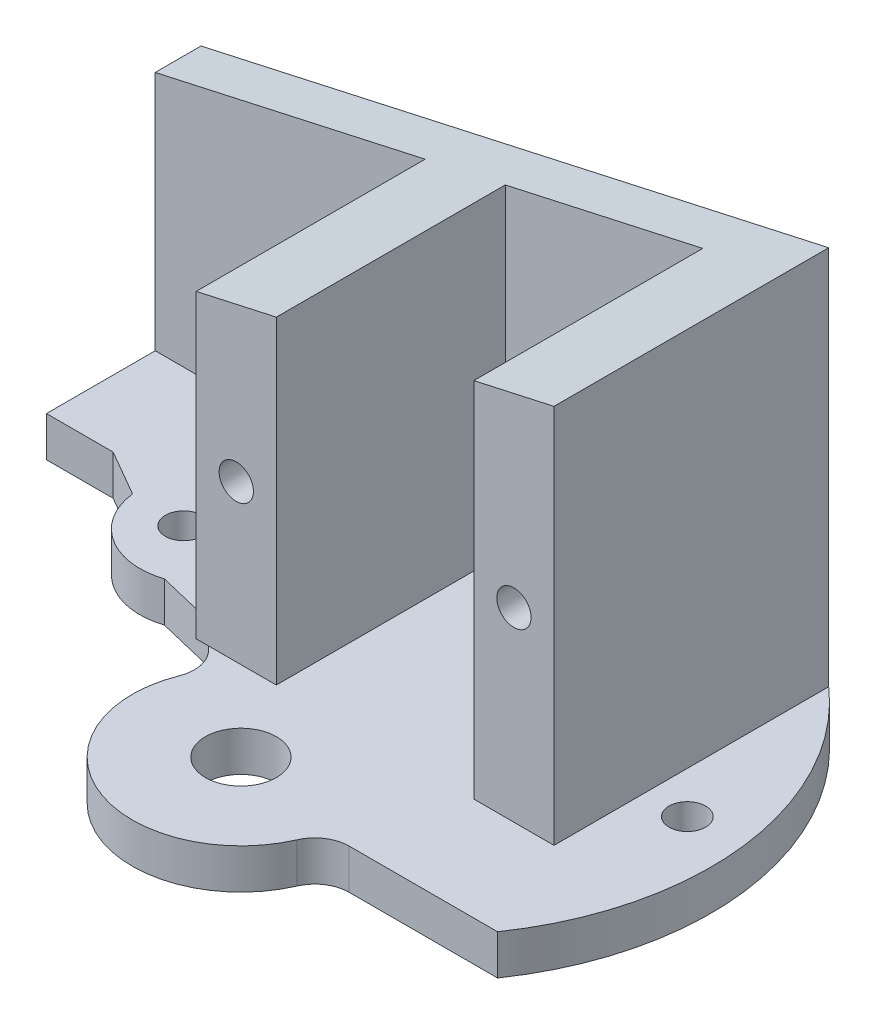
ISO-10303-21;
HEADER;
FILE_DESCRIPTION(('STEP AP214'),'2;1');
FILE_NAME('part.step','',(''),(''),'','','');
FILE_SCHEMA(('AUTOMOTIVE_DESIGN { 1 0 10303 214 1 1 1 1 }'));
ENDSEC;
DATA;
#1=APPLICATION_CONTEXT('core data for automotive mechanical design processes');
#2=APPLICATION_PROTOCOL_DEFINITION('international standard','automotive_design',2000,#1);
#3=PRODUCT_CONTEXT('',#1,'mechanical');
#4=PRODUCT('Part','Part','',(#3));
#5=PRODUCT_RELATED_PRODUCT_CATEGORY('part','',(#4));
#6=PRODUCT_DEFINITION_FORMATION('','',#4);
#7=PRODUCT_DEFINITION_CONTEXT('part definition',#1,'design');
#8=PRODUCT_DEFINITION('design','',#6,#7);
#9=PRODUCT_DEFINITION_SHAPE('','',#8);
#10=(LENGTH_UNIT() NAMED_UNIT(*) SI_UNIT(.MILLI.,.METRE.));
#11=(NAMED_UNIT(*) PLANE_ANGLE_UNIT() SI_UNIT($,.RADIAN.));
#12=(NAMED_UNIT(*) SI_UNIT($,.STERADIAN.) SOLID_ANGLE_UNIT());
#13=UNCERTAINTY_MEASURE_WITH_UNIT(LENGTH_MEASURE(1.E-05),#10,'distance_accuracy_value','');
#14=(GEOMETRIC_REPRESENTATION_CONTEXT(3) GLOBAL_UNCERTAINTY_ASSIGNED_CONTEXT((#13)) GLOBAL_UNIT_ASSIGNED_CONTEXT((#10,
#11,#12)) REPRESENTATION_CONTEXT('',''));
#15=CARTESIAN_POINT('',(0.,0.,0.));
#16=DIRECTION('',(0.,0.,1.));
#17=DIRECTION('',(1.,0.,0.));
#18=AXIS2_PLACEMENT_3D('',#15,#16,#17);
#19=CARTESIAN_POINT('',(-18.6805102122051,17.,1.64791691254111));
#20=DIRECTION('',(0.,1.,0.));
#21=DIRECTION('',(0.,0.,1.));
#22=AXIS2_PLACEMENT_3D('',#19,#20,#21);
#23=PLANE('',#22);
#24=CARTESIAN_POINT('',(0.,17.,17.5));
#25=DIRECTION('',(0.,1.,0.));
#26=DIRECTION('',(0.,0.,1.));
#27=AXIS2_PLACEMENT_3D('',#24,#25,#26);
#28=CIRCLE('',#27,3.1);
#29=CARTESIAN_POINT('',(0.,17.,20.6));
#30=VERTEX_POINT('',#29);
#31=EDGE_CURVE('E366',#30,#30,#28,.T.);
#32=ORIENTED_EDGE('',*,*,#31,.F.);
#33=EDGE_LOOP('',(#32));
#34=FACE_BOUND('',#33,.T.);
#35=CARTESIAN_POINT('',(24.,17.,2.50000000000001));
#36=DIRECTION('',(0.,1.,0.));
#37=DIRECTION('',(0.,0.,1.));
#38=AXIS2_PLACEMENT_3D('',#35,#36,#37);
#39=CIRCLE('',#38,1.6);
#40=CARTESIAN_POINT('',(24.,17.,4.10000000000001));
#41=VERTEX_POINT('',#40);
#42=EDGE_CURVE('E358',#41,#41,#39,.T.);
#43=ORIENTED_EDGE('',*,*,#42,.F.);
#44=EDGE_LOOP('',(#43));
#45=FACE_BOUND('',#44,.T.);
#46=DIRECTION('',(0.,0.,-1.));
#47=VECTOR('',#46,1.);
#48=CARTESIAN_POINT('',(20.3496,17.,-9.49999999999999));
#49=LINE('',#48,#47);
#50=CARTESIAN_POINT('',(20.3496,17.,10.5));
#51=VERTEX_POINT('',#50);
#52=CARTESIAN_POINT('',(20.3496,17.,-13.5));
#53=VERTEX_POINT('',#52);
#54=EDGE_CURVE('E197',#51,#53,#49,.T.);
#55=ORIENTED_EDGE('',*,*,#54,.F.);
#56=DIRECTION('',(1.,0.,0.));
#57=VECTOR('',#56,1.);
#58=CARTESIAN_POINT('',(13.3496,17.,10.5));
#59=LINE('',#58,#57);
#60=CARTESIAN_POINT('',(13.3496,17.,10.5));
#61=VERTEX_POINT('',#60);
#62=EDGE_CURVE('E211',#61,#51,#59,.T.);
#63=ORIENTED_EDGE('',*,*,#62,.F.);
#64=DIRECTION('',(0.,0.,-1.));
#65=VECTOR('',#64,1.);
#66=CARTESIAN_POINT('',(13.3496,17.,10.5));
#67=LINE('',#66,#65);
#68=CARTESIAN_POINT('',(13.3496,17.,-9.49999999999999));
#69=VERTEX_POINT('',#68);
#70=EDGE_CURVE('E220',#61,#69,#67,.T.);
#71=ORIENTED_EDGE('',*,*,#70,.T.);
#72=DIRECTION('',(-1.,0.,0.));
#73=VECTOR('',#72,1.);
#74=CARTESIAN_POINT('',(20.3496,17.,-9.49999999999999));
#75=LINE('',#74,#73);
#76=CARTESIAN_POINT('',(-3.90563132626724,17.,-9.49999999999999));
#77=VERTEX_POINT('',#76);
#78=EDGE_CURVE('E40',#69,#77,#75,.T.);
#79=ORIENTED_EDGE('',*,*,#78,.T.);
#80=DIRECTION('',(0.,0.,-1.));
#81=VECTOR('',#80,1.);
#82=CARTESIAN_POINT('',(-3.90563132626724,17.,10.5));
#83=LINE('',#82,#81);
#84=CARTESIAN_POINT('',(-3.90563132626724,17.,10.5));
#85=VERTEX_POINT('',#84);
#86=EDGE_CURVE('E243',#85,#77,#83,.T.);
#87=ORIENTED_EDGE('',*,*,#86,.F.);
#88=DIRECTION('',(1.,0.,0.));
#89=VECTOR('',#88,1.);
#90=CARTESIAN_POINT('',(-10.9056313262672,17.,10.5));
#91=LINE('',#90,#89);
#92=CARTESIAN_POINT('',(-9.82842712474621,17.,10.5));
#93=VERTEX_POINT('',#92);
#94=EDGE_CURVE('E229',#93,#85,#91,.T.);
#95=ORIENTED_EDGE('',*,*,#94,.F.);
#96=DIRECTION('',(0.707106781186548,0.,0.707106781186547));
#97=VECTOR('',#96,1.);
#98=CARTESIAN_POINT('',(-11.7523069819295,17.,8.57612014281668));
#99=LINE('',#98,#97);
#100=CARTESIAN_POINT('',(-9.51513943538292,17.,10.8132876893633));
#101=VERTEX_POINT('',#100);
#102=EDGE_CURVE('E283',#93,#101,#99,.T.);
#103=ORIENTED_EDGE('',*,*,#102,.T.);
#104=CARTESIAN_POINT('',(-11.6364597789426,17.,12.9346080329229));
#105=DIRECTION('',(0.,-1.,0.));
#106=DIRECTION('',(0.,0.,1.));
#107=AXIS2_PLACEMENT_3D('',#104,#105,#106);
#108=CIRCLE('',#107,3.);
#109=CARTESIAN_POINT('',(-8.84370943199635,17.,14.0303021050214));
#110=VERTEX_POINT('',#109);
#111=EDGE_CURVE('E287',#101,#110,#108,.T.);
#112=ORIENTED_EDGE('',*,*,#111,.T.);
#113=CARTESIAN_POINT('',(0.,17.,17.5));
#114=DIRECTION('',(0.,1.,0.));
#115=DIRECTION('',(0.,0.,1.));
#116=AXIS2_PLACEMENT_3D('',#113,#114,#115);
#117=CIRCLE('',#116,9.5);
#118=CARTESIAN_POINT('',(8.7068938204161,17.,21.3));
#119=VERTEX_POINT('',#118);
#120=EDGE_CURVE('E289',#110,#119,#117,.T.);
#121=ORIENTED_EDGE('',*,*,#120,.T.);
#122=CARTESIAN_POINT('',(11.4564392373896,17.,22.5));
#123=DIRECTION('',(0.,-1.,0.));
#124=DIRECTION('',(0.,0.,1.));
#125=AXIS2_PLACEMENT_3D('',#122,#123,#124);
#126=CIRCLE('',#125,3.);
#127=CARTESIAN_POINT('',(11.4564392373896,17.,19.5));
#128=VERTEX_POINT('',#127);
#129=EDGE_CURVE('E291',#119,#128,#126,.T.);
#130=ORIENTED_EDGE('',*,*,#129,.T.);
#131=DIRECTION('',(1.,0.,0.));
#132=VECTOR('',#131,1.);
#133=CARTESIAN_POINT('',(11.4564392373896,17.,19.5));
#134=LINE('',#133,#132);
#135=CARTESIAN_POINT('',(24.4182308941496,17.,19.5));
#136=VERTEX_POINT('',#135);
#137=EDGE_CURVE('E293',#128,#136,#134,.T.);
#138=ORIENTED_EDGE('',*,*,#137,.T.);
#139=CARTESIAN_POINT('',(3.8530842496332,17.,5.28470037285398));
#140=DIRECTION('',(0.,1.,0.));
#141=DIRECTION('',(0.,0.,1.));
#142=AXIS2_PLACEMENT_3D('',#139,#140,#141);
#143=CIRCLE('',#142,25.);
#144=EDGE_CURVE('E295',#136,#53,#143,.T.);
#145=ORIENTED_EDGE('',*,*,#144,.T.);
#146=EDGE_LOOP('',(#55,#63,#71,#79,#87,#95,#103,#112,#121,#130,#138,#145));
#147=FACE_BOUND('',#146,.T.);
#148=ADVANCED_FACE('F36',(#34,#45,#147),#23,.T.);
#149=CARTESIAN_POINT('',(0.,0.,-9.49999999999999));
#150=DIRECTION('',(0.,0.,-1.));
#151=DIRECTION('',(-1.,0.,0.));
#152=AXIS2_PLACEMENT_3D('',#149,#150,#151);
#153=PLANE('',#152);
#154=DIRECTION('',(0.,-1.,0.));
#155=VECTOR('',#154,1.);
#156=CARTESIAN_POINT('',(13.3496,48.661037619581,-9.49999999999999));
#157=LINE('',#156,#155);
#158=CARTESIAN_POINT('',(13.3496,48.661037619581,-9.49999999999999));
#159=VERTEX_POINT('',#158);
#160=EDGE_CURVE('E212',#159,#69,#157,.T.);
#161=ORIENTED_EDGE('',*,*,#160,.F.);
#162=DIRECTION('',(0.976296007119934,0.2164396139381,0.));
#163=VECTOR('',#162,1.);
#164=CARTESIAN_POINT('',(-34.4868,38.0559630595284,-9.49999999999999));
#165=LINE('',#164,#163);
#166=CARTESIAN_POINT('',(-3.90563132626723,44.8356449318783,-9.49999999999999));
#167=VERTEX_POINT('',#166);
#168=EDGE_CURVE('E263',#167,#159,#165,.T.);
#169=ORIENTED_EDGE('',*,*,#168,.F.);
#170=DIRECTION('',(0.,1.,0.));
#171=VECTOR('',#170,1.);
#172=CARTESIAN_POINT('',(-3.90563132626724,44.8356449318783,-9.49999999999999));
#173=LINE('',#172,#171);
#174=EDGE_CURVE('E230',#77,#167,#173,.T.);
#175=ORIENTED_EDGE('',*,*,#174,.F.);
#176=ORIENTED_EDGE('',*,*,#78,.F.);
#177=EDGE_LOOP('',(#161,#169,#175,#176));
#178=FACE_BOUND('',#177,.T.);
#179=ADVANCED_FACE('F429',(#178),#153,.F.);
#180=CARTESIAN_POINT('',(-20.,17.,2.50000000000001));
#181=DIRECTION('',(0.,1.,0.));
#182=DIRECTION('',(0.,0.,1.));
#183=AXIS2_PLACEMENT_3D('',#180,#181,#182);
#184=CIRCLE('',#183,1.6);
#185=CARTESIAN_POINT('',(-20.,17.,4.10000000000001));
#186=VERTEX_POINT('',#185);
#187=EDGE_CURVE('E274',#186,#186,#184,.T.);
#188=ORIENTED_EDGE('',*,*,#187,.F.);
#189=EDGE_LOOP('',(#188));
#190=FACE_BOUND('',#189,.T.);
#191=CARTESIAN_POINT('',(-11.7523069819295,17.,8.57612014281668));
#192=VERTEX_POINT('',#191);
#193=CARTESIAN_POINT('',(-10.9056313262672,17.,9.42279579847898));
#194=VERTEX_POINT('',#193);
#195=EDGE_CURVE('E284',#192,#194,#99,.T.);
#196=ORIENTED_EDGE('',*,*,#195,.T.);
#197=DIRECTION('',(0.,0.,-1.));
#198=VECTOR('',#197,1.);
#199=CARTESIAN_POINT('',(-10.9056313262672,17.,10.5));
#200=LINE('',#199,#198);
#201=CARTESIAN_POINT('',(-10.9056313262672,17.,-9.49999999999999));
#202=VERTEX_POINT('',#201);
#203=EDGE_CURVE('E246',#194,#202,#200,.T.);
#204=ORIENTED_EDGE('',*,*,#203,.T.);
#205=CARTESIAN_POINT('',(-34.4868,17.,-9.49999999999999));
#206=VERTEX_POINT('',#205);
#207=EDGE_CURVE('E62',#202,#206,#75,.T.);
#208=ORIENTED_EDGE('',*,*,#207,.T.);
#209=DIRECTION('',(0.,0.,1.));
#210=VECTOR('',#209,1.);
#211=CARTESIAN_POINT('',(-34.4868,17.,-13.5));
#212=LINE('',#211,#210);
#213=CARTESIAN_POINT('',(-34.4868,17.,0.));
#214=VERTEX_POINT('',#213);
#215=EDGE_CURVE('E264',#206,#214,#212,.T.);
#216=ORIENTED_EDGE('',*,*,#215,.T.);
#217=DIRECTION('',(1.,0.,0.));
#218=VECTOR('',#217,1.);
#219=CARTESIAN_POINT('',(-34.4868,17.,0.));
#220=LINE('',#219,#218);
#221=CARTESIAN_POINT('',(-28.6613749786786,17.,0.));
#222=VERTEX_POINT('',#221);
#223=EDGE_CURVE('E267',#214,#222,#220,.T.);
#224=ORIENTED_EDGE('',*,*,#223,.T.);
#225=DIRECTION('',(0.865769658866911,0.,0.500442701800588));
#226=VECTOR('',#225,1.);
#227=CARTESIAN_POINT('',(-28.6613749786786,17.,0.));
#228=LINE('',#227,#226);
#229=CARTESIAN_POINT('',(-24.6424002082218,17.,2.32309664816397));
#230=VERTEX_POINT('',#229);
#231=EDGE_CURVE('E277',#222,#230,#228,.T.);
#232=ORIENTED_EDGE('',*,*,#231,.T.);
#233=CARTESIAN_POINT('',(-18.6805102122051,17.,1.64791691254111));
#234=DIRECTION('',(0.,1.,0.));
#235=DIRECTION('',(0.,0.,1.));
#236=AXIS2_PLACEMENT_3D('',#233,#234,#235);
#237=CIRCLE('',#236,6.);
#238=CARTESIAN_POINT('',(-16.8299633080181,17.,7.35540989592743));
#239=VERTEX_POINT('',#238);
#240=EDGE_CURVE('E279',#230,#239,#237,.T.);
#241=ORIENTED_EDGE('',*,*,#240,.T.);
#242=DIRECTION('',(0.972297162093524,0.,0.233748216217537));
#243=VECTOR('',#242,1.);
#244=CARTESIAN_POINT('',(-16.8299633080181,17.,7.35540989592743));
#245=LINE('',#244,#243);
#246=EDGE_CURVE('E281',#239,#192,#245,.T.);
#247=ORIENTED_EDGE('',*,*,#246,.T.);
#248=EDGE_LOOP('',(#196,#204,#208,#216,#224,#232,#241,#247));
#249=FACE_BOUND('',#248,.T.);
#250=ADVANCED_FACE('F385',(#190,#249),#23,.T.);
#251=DIRECTION('',(0.,-1.,0.));
#252=VECTOR('',#251,1.);
#253=CARTESIAN_POINT('',(-10.9056313262672,43.2837822933777,-9.49999999999999));
#254=LINE('',#253,#252);
#255=CARTESIAN_POINT('',(-10.9056313262672,43.2837822933777,-9.49999999999999));
#256=VERTEX_POINT('',#255);
#257=EDGE_CURVE('E225',#256,#202,#254,.T.);
#258=ORIENTED_EDGE('',*,*,#257,.F.);
#259=CARTESIAN_POINT('',(-34.4868,38.0559630595284,-9.49999999999999));
#260=VERTEX_POINT('',#259);
#261=EDGE_CURVE('E254',#260,#256,#165,.T.);
#262=ORIENTED_EDGE('',*,*,#261,.F.);
#263=DIRECTION('',(0.,1.,0.));
#264=VECTOR('',#263,1.);
#265=CARTESIAN_POINT('',(-34.4868,17.,-9.49999999999999));
#266=LINE('',#265,#264);
#267=EDGE_CURVE('E260',#206,#260,#266,.T.);
#268=ORIENTED_EDGE('',*,*,#267,.F.);
#269=ORIENTED_EDGE('',*,*,#207,.F.);
#270=EDGE_LOOP('',(#258,#262,#268,#269));
#271=FACE_BOUND('',#270,.T.);
#272=ADVANCED_FACE('F380',(#271),#153,.F.);
#273=CARTESIAN_POINT('',(20.3496,17.,-13.5));
#274=DIRECTION('',(0.,0.,1.));
#275=DIRECTION('',(1.,0.,0.));
#276=AXIS2_PLACEMENT_3D('',#273,#274,#275);
#277=PLANE('',#276);
#278=CARTESIAN_POINT('',(16.8496,33.2325747698883,-13.5));
#279=DIRECTION('',(0.,0.,1.));
#280=DIRECTION('',(1.,0.,0.));
#281=AXIS2_PLACEMENT_3D('',#278,#279,#280);
#282=CIRCLE('',#281,1.5);
#283=CARTESIAN_POINT('',(18.3496,33.2325747698883,-13.5));
#284=VERTEX_POINT('',#283);
#285=EDGE_CURVE('E543',#284,#284,#282,.T.);
#286=ORIENTED_EDGE('',*,*,#285,.T.);
#287=EDGE_LOOP('',(#286));
#288=FACE_BOUND('',#287,.T.);
#289=CARTESIAN_POINT('',(-7.40563132626724,30.6415938203358,-13.5));
#290=DIRECTION('',(0.,0.,1.));
#291=DIRECTION('',(1.,0.,0.));
#292=AXIS2_PLACEMENT_3D('',#289,#290,#291);
#293=CIRCLE('',#292,1.50000000000001);
#294=CARTESIAN_POINT('',(-5.90563132626723,30.6415938203358,-13.5));
#295=VERTEX_POINT('',#294);
#296=EDGE_CURVE('E214',#295,#295,#293,.T.);
#297=ORIENTED_EDGE('',*,*,#296,.T.);
#298=EDGE_LOOP('',(#297));
#299=FACE_BOUND('',#298,.T.);
#300=DIRECTION('',(-1.,0.,0.));
#301=VECTOR('',#300,1.);
#302=CARTESIAN_POINT('',(20.3496,13.5,-13.5));
#303=LINE('',#302,#301);
#304=CARTESIAN_POINT('',(20.3496,13.5,-13.5));
#305=VERTEX_POINT('',#304);
#306=CARTESIAN_POINT('',(-34.4868,13.5,-13.5));
#307=VERTEX_POINT('',#306);
#308=EDGE_CURVE('E299',#305,#307,#303,.T.);
#309=ORIENTED_EDGE('',*,*,#308,.T.);
#310=DIRECTION('',(0.,-1.,0.));
#311=VECTOR('',#310,1.);
#312=CARTESIAN_POINT('',(-34.4868,17.,-13.5));
#313=LINE('',#312,#311);
#314=CARTESIAN_POINT('',(-34.4868,38.0559630595284,-13.5));
#315=VERTEX_POINT('',#314);
#316=EDGE_CURVE('E12',#315,#307,#313,.T.);
#317=ORIENTED_EDGE('',*,*,#316,.F.);
#318=DIRECTION('',(0.976296007119934,0.2164396139381,0.));
#319=VECTOR('',#318,1.);
#320=CARTESIAN_POINT('',(-34.4868,38.0559630595284,-13.5));
#321=LINE('',#320,#319);
#322=CARTESIAN_POINT('',(20.3496,50.2129002580815,-13.5));
#323=VERTEX_POINT('',#322);
#324=EDGE_CURVE('E251',#315,#323,#321,.T.);
#325=ORIENTED_EDGE('',*,*,#324,.T.);
#326=DIRECTION('',(0.,-1.,0.));
#327=VECTOR('',#326,1.);
#328=CARTESIAN_POINT('',(20.3496,50.2129002580815,-13.5));
#329=LINE('',#328,#327);
#330=EDGE_CURVE('E194',#323,#53,#329,.T.);
#331=ORIENTED_EDGE('',*,*,#330,.T.);
#332=DIRECTION('',(0.,-1.,0.));
#333=VECTOR('',#332,1.);
#334=CARTESIAN_POINT('',(20.3496,17.,-13.5));
#335=LINE('',#334,#333);
#336=EDGE_CURVE('E298',#53,#305,#335,.T.);
#337=ORIENTED_EDGE('',*,*,#336,.T.);
#338=EDGE_LOOP('',(#309,#317,#325,#331,#337));
#339=FACE_BOUND('',#338,.T.);
#340=ADVANCED_FACE('F38',(#288,#299,#339),#277,.F.);
#341=CARTESIAN_POINT('',(-34.4868,17.,-13.5));
#342=DIRECTION('',(1.,0.,0.));
#343=DIRECTION('',(0.,0.,-1.));
#344=AXIS2_PLACEMENT_3D('',#341,#342,#343);
#345=PLANE('',#344);
#346=DIRECTION('',(0.,0.,1.));
#347=VECTOR('',#346,1.);
#348=CARTESIAN_POINT('',(-34.4868,13.5,-13.5));
#349=LINE('',#348,#347);
#350=CARTESIAN_POINT('',(-34.4868,13.5,0.));
#351=VERTEX_POINT('',#350);
#352=EDGE_CURVE('E302',#307,#351,#349,.T.);
#353=ORIENTED_EDGE('',*,*,#352,.T.);
#354=DIRECTION('',(0.,-1.,0.));
#355=VECTOR('',#354,1.);
#356=CARTESIAN_POINT('',(-34.4868,17.,0.));
#357=LINE('',#356,#355);
#358=EDGE_CURVE('E46',#214,#351,#357,.T.);
#359=ORIENTED_EDGE('',*,*,#358,.F.);
#360=ORIENTED_EDGE('',*,*,#215,.F.);
#361=ORIENTED_EDGE('',*,*,#267,.T.);
#362=DIRECTION('',(0.,0.,-1.));
#363=VECTOR('',#362,1.);
#364=CARTESIAN_POINT('',(-34.4868,38.0559630595284,-9.49999999999999));
#365=LINE('',#364,#363);
#366=EDGE_CURVE('E198',#260,#315,#365,.T.);
#367=ORIENTED_EDGE('',*,*,#366,.T.);
#368=ORIENTED_EDGE('',*,*,#316,.T.);
#369=EDGE_LOOP('',(#353,#359,#360,#361,#367,#368));
#370=FACE_BOUND('',#369,.T.);
#371=ADVANCED_FACE('F382',(#370),#345,.F.);
#372=CARTESIAN_POINT('',(-34.4868,17.,0.));
#373=DIRECTION('',(0.,0.,-1.));
#374=DIRECTION('',(-1.,0.,0.));
#375=AXIS2_PLACEMENT_3D('',#372,#373,#374);
#376=PLANE('',#375);
#377=DIRECTION('',(1.,0.,0.));
#378=VECTOR('',#377,1.);
#379=CARTESIAN_POINT('',(-34.4868,13.5,0.));
#380=LINE('',#379,#378);
#381=CARTESIAN_POINT('',(-28.6613749786786,13.5,0.));
#382=VERTEX_POINT('',#381);
#383=EDGE_CURVE('E305',#351,#382,#380,.T.);
#384=ORIENTED_EDGE('',*,*,#383,.T.);
#385=DIRECTION('',(0.,-1.,0.));
#386=VECTOR('',#385,1.);
#387=CARTESIAN_POINT('',(-28.6613749786786,17.,0.));
#388=LINE('',#387,#386);
#389=EDGE_CURVE('E350',#222,#382,#388,.T.);
#390=ORIENTED_EDGE('',*,*,#389,.F.);
#391=ORIENTED_EDGE('',*,*,#223,.F.);
#392=ORIENTED_EDGE('',*,*,#358,.T.);
#393=EDGE_LOOP('',(#384,#390,#391,#392));
#394=FACE_BOUND('',#393,.T.);
#395=ADVANCED_FACE('F390',(#394),#376,.F.);
#396=CARTESIAN_POINT('',(-28.6613749786786,17.,0.));
#397=DIRECTION('',(0.500442701800588,0.,-0.865769658866911));
#398=DIRECTION('',(-0.865769658866911,0.,-0.500442701800588));
#399=AXIS2_PLACEMENT_3D('',#396,#397,#398);
#400=PLANE('',#399);
#401=DIRECTION('',(0.865769658866911,0.,0.500442701800588));
#402=VECTOR('',#401,1.);
#403=CARTESIAN_POINT('',(-28.6613749786786,13.5,0.));
#404=LINE('',#403,#402);
#405=CARTESIAN_POINT('',(-24.6424002082218,13.5,2.32309664816397));
#406=VERTEX_POINT('',#405);
#407=EDGE_CURVE('E307',#382,#406,#404,.T.);
#408=ORIENTED_EDGE('',*,*,#407,.T.);
#409=DIRECTION('',(0.,-1.,0.));
#410=VECTOR('',#409,1.);
#411=CARTESIAN_POINT('',(-24.6424002082218,17.,2.32309664816397));
#412=LINE('',#411,#410);
#413=EDGE_CURVE('E347',#230,#406,#412,.T.);
#414=ORIENTED_EDGE('',*,*,#413,.F.);
#415=ORIENTED_EDGE('',*,*,#231,.F.);
#416=ORIENTED_EDGE('',*,*,#389,.T.);
#417=EDGE_LOOP('',(#408,#414,#415,#416));
#418=FACE_BOUND('',#417,.T.);
#419=ADVANCED_FACE('F394',(#418),#400,.F.);
#420=CARTESIAN_POINT('',(-18.6805102122051,17.,1.64791691254111));
#421=DIRECTION('',(0.,-1.,0.));
#422=DIRECTION('',(0.,0.,-1.));
#423=AXIS2_PLACEMENT_3D('',#420,#421,#422);
#424=CYLINDRICAL_SURFACE('',#423,6.);
#425=CARTESIAN_POINT('',(-18.6805102122051,13.5,1.64791691254111));
#426=DIRECTION('',(0.,1.,0.));
#427=DIRECTION('',(0.,0.,1.));
#428=AXIS2_PLACEMENT_3D('',#425,#426,#427);
#429=CIRCLE('',#428,6.);
#430=CARTESIAN_POINT('',(-16.8299633080181,13.5,7.35540989592743));
#431=VERTEX_POINT('',#430);
#432=EDGE_CURVE('E309',#406,#431,#429,.T.);
#433=ORIENTED_EDGE('',*,*,#432,.T.);
#434=DIRECTION('',(0.,-1.,0.));
#435=VECTOR('',#434,1.);
#436=CARTESIAN_POINT('',(-16.8299633080181,17.,7.35540989592743));
#437=LINE('',#436,#435);
#438=EDGE_CURVE('E344',#239,#431,#437,.T.);
#439=ORIENTED_EDGE('',*,*,#438,.F.);
#440=ORIENTED_EDGE('',*,*,#240,.F.);
#441=ORIENTED_EDGE('',*,*,#413,.T.);
#442=EDGE_LOOP('',(#433,#439,#440,#441));
#443=FACE_BOUND('',#442,.T.);
#444=ADVANCED_FACE('F399',(#443),#424,.T.);
#445=CARTESIAN_POINT('',(-16.8299633080181,17.,7.35540989592743));
#446=DIRECTION('',(0.233748216217537,0.,-0.972297162093524));
#447=DIRECTION('',(-0.972297162093524,0.,-0.233748216217537));
#448=AXIS2_PLACEMENT_3D('',#445,#446,#447);
#449=PLANE('',#448);
#450=DIRECTION('',(0.972297162093524,0.,0.233748216217537));
#451=VECTOR('',#450,1.);
#452=CARTESIAN_POINT('',(-16.8299633080181,13.5,7.35540989592743));
#453=LINE('',#452,#451);
#454=CARTESIAN_POINT('',(-11.7523069819295,13.5,8.57612014281668));
#455=VERTEX_POINT('',#454);
#456=EDGE_CURVE('E311',#431,#455,#453,.T.);
#457=ORIENTED_EDGE('',*,*,#456,.T.);
#458=DIRECTION('',(0.,-1.,0.));
#459=VECTOR('',#458,1.);
#460=CARTESIAN_POINT('',(-11.7523069819295,17.,8.57612014281668));
#461=LINE('',#460,#459);
#462=EDGE_CURVE('E341',#192,#455,#461,.T.);
#463=ORIENTED_EDGE('',*,*,#462,.F.);
#464=ORIENTED_EDGE('',*,*,#246,.F.);
#465=ORIENTED_EDGE('',*,*,#438,.T.);
#466=EDGE_LOOP('',(#457,#463,#464,#465));
#467=FACE_BOUND('',#466,.T.);
#468=ADVANCED_FACE('F404',(#467),#449,.F.);
#469=CARTESIAN_POINT('',(-11.7523069819295,17.,8.57612014281668));
#470=DIRECTION('',(0.707106781186547,0.,-0.707106781186548));
#471=DIRECTION('',(-0.707106781186548,0.,-0.707106781186547));
#472=AXIS2_PLACEMENT_3D('',#469,#470,#471);
#473=PLANE('',#472);
#474=DIRECTION('',(0.707106781186548,0.,0.707106781186547));
#475=VECTOR('',#474,1.);
#476=CARTESIAN_POINT('',(-11.7523069819295,13.5,8.57612014281668));
#477=LINE('',#476,#475);
#478=CARTESIAN_POINT('',(-9.51513943538292,13.5,10.8132876893633));
#479=VERTEX_POINT('',#478);
#480=EDGE_CURVE('E313',#455,#479,#477,.T.);
#481=ORIENTED_EDGE('',*,*,#480,.T.);
#482=DIRECTION('',(0.,-1.,0.));
#483=VECTOR('',#482,1.);
#484=CARTESIAN_POINT('',(-9.51513943538292,17.,10.8132876893633));
#485=LINE('',#484,#483);
#486=EDGE_CURVE('E338',#101,#479,#485,.T.);
#487=ORIENTED_EDGE('',*,*,#486,.F.);
#488=ORIENTED_EDGE('',*,*,#102,.F.);
#489=DIRECTION('',(0.707106781186548,0.,0.707106781186547));
#490=VECTOR('',#489,1.);
#491=CARTESIAN_POINT('',(-11.7523069819295,17.,8.57612014281668));
#492=LINE('',#491,#490);
#493=EDGE_CURVE('E250',#194,#93,#492,.T.);
#494=ORIENTED_EDGE('',*,*,#493,.F.);
#495=ORIENTED_EDGE('',*,*,#195,.F.);
#496=ORIENTED_EDGE('',*,*,#462,.T.);
#497=EDGE_LOOP('',(#481,#487,#488,#494,#495,#496));
#498=FACE_BOUND('',#497,.T.);
#499=ADVANCED_FACE('F409',(#498),#473,.F.);
#500=CARTESIAN_POINT('',(-11.6364597789426,17.,12.9346080329229));
#501=DIRECTION('',(0.,-1.,0.));
#502=DIRECTION('',(0.,0.,-1.));
#503=AXIS2_PLACEMENT_3D('',#500,#501,#502);
#504=CYLINDRICAL_SURFACE('',#503,3.);
#505=CARTESIAN_POINT('',(-11.6364597789426,13.5,12.9346080329229));
#506=DIRECTION('',(0.,-1.,0.));
#507=DIRECTION('',(0.,0.,1.));
#508=AXIS2_PLACEMENT_3D('',#505,#506,#507);
#509=CIRCLE('',#508,3.);
#510=CARTESIAN_POINT('',(-8.84370943199635,13.5,14.0303021050214));
#511=VERTEX_POINT('',#510);
#512=EDGE_CURVE('E315',#479,#511,#509,.T.);
#513=ORIENTED_EDGE('',*,*,#512,.T.);
#514=DIRECTION('',(0.,-1.,0.));
#515=VECTOR('',#514,1.);
#516=CARTESIAN_POINT('',(-8.84370943199635,17.,14.0303021050214));
#517=LINE('',#516,#515);
#518=EDGE_CURVE('E335',#110,#511,#517,.T.);
#519=ORIENTED_EDGE('',*,*,#518,.F.);
#520=ORIENTED_EDGE('',*,*,#111,.F.);
#521=ORIENTED_EDGE('',*,*,#486,.T.);
#522=EDGE_LOOP('',(#513,#519,#520,#521));
#523=FACE_BOUND('',#522,.T.);
#524=ADVANCED_FACE('F448',(#523),#504,.F.);
#525=CARTESIAN_POINT('',(0.,17.,17.5));
#526=DIRECTION('',(0.,-1.,0.));
#527=DIRECTION('',(0.,0.,-1.));
#528=AXIS2_PLACEMENT_3D('',#525,#526,#527);
#529=CYLINDRICAL_SURFACE('',#528,9.5);
#530=CARTESIAN_POINT('',(0.,13.5,17.5));
#531=DIRECTION('',(0.,1.,0.));
#532=DIRECTION('',(0.,0.,1.));
#533=AXIS2_PLACEMENT_3D('',#530,#531,#532);
#534=CIRCLE('',#533,9.5);
#535=CARTESIAN_POINT('',(8.7068938204161,13.5,21.3));
#536=VERTEX_POINT('',#535);
#537=EDGE_CURVE('E317',#511,#536,#534,.T.);
#538=ORIENTED_EDGE('',*,*,#537,.T.);
#539=DIRECTION('',(0.,-1.,0.));
#540=VECTOR('',#539,1.);
#541=CARTESIAN_POINT('',(8.7068938204161,17.,21.3));
#542=LINE('',#541,#540);
#543=EDGE_CURVE('E332',#119,#536,#542,.T.);
#544=ORIENTED_EDGE('',*,*,#543,.F.);
#545=ORIENTED_EDGE('',*,*,#120,.F.);
#546=ORIENTED_EDGE('',*,*,#518,.T.);
#547=EDGE_LOOP('',(#538,#544,#545,#546));
#548=FACE_BOUND('',#547,.T.);
#549=ADVANCED_FACE('F455',(#548),#529,.T.);
#550=CARTESIAN_POINT('',(11.4564392373896,17.,22.5));
#551=DIRECTION('',(0.,-1.,0.));
#552=DIRECTION('',(0.,0.,-1.));
#553=AXIS2_PLACEMENT_3D('',#550,#551,#552);
#554=CYLINDRICAL_SURFACE('',#553,3.);
#555=CARTESIAN_POINT('',(11.4564392373896,13.5,22.5));
#556=DIRECTION('',(0.,-1.,0.));
#557=DIRECTION('',(0.,0.,1.));
#558=AXIS2_PLACEMENT_3D('',#555,#556,#557);
#559=CIRCLE('',#558,3.);
#560=CARTESIAN_POINT('',(11.4564392373896,13.5,19.5));
#561=VERTEX_POINT('',#560);
#562=EDGE_CURVE('E319',#536,#561,#559,.T.);
#563=ORIENTED_EDGE('',*,*,#562,.T.);
#564=DIRECTION('',(0.,-1.,0.));
#565=VECTOR('',#564,1.);
#566=CARTESIAN_POINT('',(11.4564392373896,17.,19.5));
#567=LINE('',#566,#565);
#568=EDGE_CURVE('E329',#128,#561,#567,.T.);
#569=ORIENTED_EDGE('',*,*,#568,.F.);
#570=ORIENTED_EDGE('',*,*,#129,.F.);
#571=ORIENTED_EDGE('',*,*,#543,.T.);
#572=EDGE_LOOP('',(#563,#569,#570,#571));
#573=FACE_BOUND('',#572,.T.);
#574=ADVANCED_FACE('F458',(#573),#554,.F.);
#575=CARTESIAN_POINT('',(11.4564392373896,17.,19.5));
#576=DIRECTION('',(0.,0.,-1.));
#577=DIRECTION('',(-1.,0.,0.));
#578=AXIS2_PLACEMENT_3D('',#575,#576,#577);
#579=PLANE('',#578);
#580=DIRECTION('',(1.,0.,0.));
#581=VECTOR('',#580,1.);
#582=CARTESIAN_POINT('',(11.4564392373896,13.5,19.5));
#583=LINE('',#582,#581);
#584=CARTESIAN_POINT('',(24.4182308941496,13.5,19.5));
#585=VERTEX_POINT('',#584);
#586=EDGE_CURVE('E321',#561,#585,#583,.T.);
#587=ORIENTED_EDGE('',*,*,#586,.T.);
#588=DIRECTION('',(0.,-1.,0.));
#589=VECTOR('',#588,1.);
#590=CARTESIAN_POINT('',(24.4182308941496,17.,19.5));
#591=LINE('',#590,#589);
#592=EDGE_CURVE('E326',#136,#585,#591,.T.);
#593=ORIENTED_EDGE('',*,*,#592,.F.);
#594=ORIENTED_EDGE('',*,*,#137,.F.);
#595=ORIENTED_EDGE('',*,*,#568,.T.);
#596=EDGE_LOOP('',(#587,#593,#594,#595));
#597=FACE_BOUND('',#596,.T.);
#598=ADVANCED_FACE('F460',(#597),#579,.F.);
#599=CARTESIAN_POINT('',(3.8530842496332,17.,5.28470037285398));
#600=DIRECTION('',(0.,-1.,0.));
#601=DIRECTION('',(0.,0.,-1.));
#602=AXIS2_PLACEMENT_3D('',#599,#600,#601);
#603=CYLINDRICAL_SURFACE('',#602,25.);
#604=CARTESIAN_POINT('',(3.8530842496332,13.5,5.28470037285398));
#605=DIRECTION('',(0.,1.,0.));
#606=DIRECTION('',(0.,0.,1.));
#607=AXIS2_PLACEMENT_3D('',#604,#605,#606);
#608=CIRCLE('',#607,25.);
#609=EDGE_CURVE('E268',#585,#305,#608,.T.);
#610=ORIENTED_EDGE('',*,*,#609,.T.);
#611=ORIENTED_EDGE('',*,*,#336,.F.);
#612=ORIENTED_EDGE('',*,*,#144,.F.);
#613=ORIENTED_EDGE('',*,*,#592,.T.);
#614=EDGE_LOOP('',(#610,#611,#612,#613));
#615=FACE_BOUND('',#614,.T.);
#616=ADVANCED_FACE('F438',(#615),#603,.T.);
#617=CARTESIAN_POINT('',(-18.6805102122051,13.5,1.64791691254111));
#618=DIRECTION('',(0.,1.,0.));
#619=DIRECTION('',(0.,0.,1.));
#620=AXIS2_PLACEMENT_3D('',#617,#618,#619);
#621=PLANE('',#620);
#622=CARTESIAN_POINT('',(0.,13.5,17.5));
#623=DIRECTION('',(0.,1.,0.));
#624=DIRECTION('',(0.,0.,1.));
#625=AXIS2_PLACEMENT_3D('',#622,#623,#624);
#626=CIRCLE('',#625,3.1);
#627=CARTESIAN_POINT('',(0.,13.5,20.6));
#628=VERTEX_POINT('',#627);
#629=EDGE_CURVE('E269',#628,#628,#626,.T.);
#630=ORIENTED_EDGE('',*,*,#629,.T.);
#631=EDGE_LOOP('',(#630));
#632=FACE_BOUND('',#631,.T.);
#633=CARTESIAN_POINT('',(24.,13.5,2.50000000000001));
#634=DIRECTION('',(0.,1.,0.));
#635=DIRECTION('',(0.,0.,1.));
#636=AXIS2_PLACEMENT_3D('',#633,#634,#635);
#637=CIRCLE('',#636,1.6);
#638=CARTESIAN_POINT('',(24.,13.5,4.10000000000001));
#639=VERTEX_POINT('',#638);
#640=EDGE_CURVE('E356',#639,#639,#637,.T.);
#641=ORIENTED_EDGE('',*,*,#640,.T.);
#642=EDGE_LOOP('',(#641));
#643=FACE_BOUND('',#642,.T.);
#644=CARTESIAN_POINT('',(-20.,13.5,2.50000000000001));
#645=DIRECTION('',(0.,1.,0.));
#646=DIRECTION('',(0.,0.,1.));
#647=AXIS2_PLACEMENT_3D('',#644,#645,#646);
#648=CIRCLE('',#647,1.6);
#649=CARTESIAN_POINT('',(-20.,13.5,4.10000000000001));
#650=VERTEX_POINT('',#649);
#651=EDGE_CURVE('E303',#650,#650,#648,.T.);
#652=ORIENTED_EDGE('',*,*,#651,.T.);
#653=EDGE_LOOP('',(#652));
#654=FACE_BOUND('',#653,.T.);
#655=ORIENTED_EDGE('',*,*,#308,.F.);
#656=ORIENTED_EDGE('',*,*,#609,.F.);
#657=ORIENTED_EDGE('',*,*,#586,.F.);
#658=ORIENTED_EDGE('',*,*,#562,.F.);
#659=ORIENTED_EDGE('',*,*,#537,.F.);
#660=ORIENTED_EDGE('',*,*,#512,.F.);
#661=ORIENTED_EDGE('',*,*,#480,.F.);
#662=ORIENTED_EDGE('',*,*,#456,.F.);
#663=ORIENTED_EDGE('',*,*,#432,.F.);
#664=ORIENTED_EDGE('',*,*,#407,.F.);
#665=ORIENTED_EDGE('',*,*,#383,.F.);
#666=ORIENTED_EDGE('',*,*,#352,.F.);
#667=EDGE_LOOP('',(#655,#656,#657,#658,#659,#660,#661,#662,#663,#664,#665,#666));
#668=FACE_BOUND('',#667,.T.);
#669=ADVANCED_FACE('F442',(#632,#643,#654,#668),#621,.F.);
#670=CARTESIAN_POINT('',(-20.,0.,2.50000000000001));
#671=DIRECTION('',(0.,1.,0.));
#672=DIRECTION('',(0.,0.,1.));
#673=AXIS2_PLACEMENT_3D('',#670,#671,#672);
#674=CYLINDRICAL_SURFACE('',#673,1.6);
#675=ORIENTED_EDGE('',*,*,#187,.T.);
#676=EDGE_LOOP('',(#675));
#677=FACE_BOUND('',#676,.T.);
#678=ORIENTED_EDGE('',*,*,#651,.F.);
#679=EDGE_LOOP('',(#678));
#680=FACE_BOUND('',#679,.T.);
#681=ADVANCED_FACE('F487',(#677,#680),#674,.F.);
#682=CARTESIAN_POINT('',(24.,0.,2.50000000000001));
#683=DIRECTION('',(0.,1.,0.));
#684=DIRECTION('',(0.,0.,1.));
#685=AXIS2_PLACEMENT_3D('',#682,#683,#684);
#686=CYLINDRICAL_SURFACE('',#685,1.6);
#687=ORIENTED_EDGE('',*,*,#42,.T.);
#688=EDGE_LOOP('',(#687));
#689=FACE_BOUND('',#688,.T.);
#690=ORIENTED_EDGE('',*,*,#640,.F.);
#691=EDGE_LOOP('',(#690));
#692=FACE_BOUND('',#691,.T.);
#693=ADVANCED_FACE('F490',(#689,#692),#686,.F.);
#694=CARTESIAN_POINT('',(0.,12.,17.5));
#695=DIRECTION('',(0.,1.,0.));
#696=DIRECTION('',(0.,0.,1.));
#697=AXIS2_PLACEMENT_3D('',#694,#695,#696);
#698=CYLINDRICAL_SURFACE('',#697,3.1);
#699=ORIENTED_EDGE('',*,*,#31,.T.);
#700=EDGE_LOOP('',(#699));
#701=FACE_BOUND('',#700,.T.);
#702=ORIENTED_EDGE('',*,*,#629,.F.);
#703=EDGE_LOOP('',(#702));
#704=FACE_BOUND('',#703,.T.);
#705=ADVANCED_FACE('F499',(#701,#704),#698,.F.);
#706=CARTESIAN_POINT('',(20.3496,50.2129002580815,-9.49999999999999));
#707=DIRECTION('',(1.,0.,0.));
#708=DIRECTION('',(0.,1.,0.));
#709=AXIS2_PLACEMENT_3D('',#706,#707,#708);
#710=PLANE('',#709);
#711=ORIENTED_EDGE('',*,*,#330,.F.);
#712=DIRECTION('',(0.,0.,-1.));
#713=VECTOR('',#712,1.);
#714=CARTESIAN_POINT('',(20.3496,50.2129002580815,-9.49999999999999));
#715=LINE('',#714,#713);
#716=CARTESIAN_POINT('',(20.3496,50.2129002580815,10.5));
#717=VERTEX_POINT('',#716);
#718=EDGE_CURVE('E188',#717,#323,#715,.T.);
#719=ORIENTED_EDGE('',*,*,#718,.F.);
#720=DIRECTION('',(0.,1.,0.));
#721=VECTOR('',#720,1.);
#722=CARTESIAN_POINT('',(20.3496,17.,10.5));
#723=LINE('',#722,#721);
#724=EDGE_CURVE('E192',#51,#717,#723,.T.);
#725=ORIENTED_EDGE('',*,*,#724,.F.);
#726=ORIENTED_EDGE('',*,*,#54,.T.);
#727=EDGE_LOOP('',(#711,#719,#725,#726));
#728=FACE_BOUND('',#727,.T.);
#729=ADVANCED_FACE('F190',(#728),#710,.T.);
#730=CARTESIAN_POINT('',(-34.4868,38.0559630595284,-9.49999999999999));
#731=DIRECTION('',(-0.2164396139381,0.976296007119934,0.));
#732=DIRECTION('',(-0.976296007119934,-0.2164396139381,0.));
#733=AXIS2_PLACEMENT_3D('',#730,#731,#732);
#734=PLANE('',#733);
#735=ORIENTED_EDGE('',*,*,#324,.F.);
#736=ORIENTED_EDGE('',*,*,#366,.F.);
#737=ORIENTED_EDGE('',*,*,#261,.T.);
#738=DIRECTION('',(0.,0.,-1.));
#739=VECTOR('',#738,1.);
#740=CARTESIAN_POINT('',(-10.9056313262672,43.2837822933777,10.5));
#741=LINE('',#740,#739);
#742=CARTESIAN_POINT('',(-10.9056313262672,43.2837822933777,10.5));
#743=VERTEX_POINT('',#742);
#744=EDGE_CURVE('E238',#743,#256,#741,.T.);
#745=ORIENTED_EDGE('',*,*,#744,.F.);
#746=DIRECTION('',(-0.976296007119934,-0.2164396139381,0.));
#747=VECTOR('',#746,1.);
#748=CARTESIAN_POINT('',(-10.9056313262672,43.2837822933777,10.5));
#749=LINE('',#748,#747);
#750=CARTESIAN_POINT('',(-3.90563132626724,44.8356449318783,10.5));
#751=VERTEX_POINT('',#750);
#752=EDGE_CURVE('E236',#751,#743,#749,.T.);
#753=ORIENTED_EDGE('',*,*,#752,.F.);
#754=DIRECTION('',(0.,0.,-1.));
#755=VECTOR('',#754,1.);
#756=CARTESIAN_POINT('',(-3.90563132626724,44.8356449318783,10.5));
#757=LINE('',#756,#755);
#758=EDGE_CURVE('E54',#751,#167,#757,.T.);
#759=ORIENTED_EDGE('',*,*,#758,.T.);
#760=ORIENTED_EDGE('',*,*,#168,.T.);
#761=DIRECTION('',(0.,0.,-1.));
#762=VECTOR('',#761,1.);
#763=CARTESIAN_POINT('',(13.3496,48.661037619581,10.5));
#764=LINE('',#763,#762);
#765=CARTESIAN_POINT('',(13.3496,48.661037619581,10.5));
#766=VERTEX_POINT('',#765);
#767=EDGE_CURVE('E203',#766,#159,#764,.T.);
#768=ORIENTED_EDGE('',*,*,#767,.F.);
#769=DIRECTION('',(-0.976296007119934,-0.2164396139381,0.));
#770=VECTOR('',#769,1.);
#771=CARTESIAN_POINT('',(20.3496,50.2129002580815,10.5));
#772=LINE('',#771,#770);
#773=EDGE_CURVE('E201',#717,#766,#772,.T.);
#774=ORIENTED_EDGE('',*,*,#773,.F.);
#775=ORIENTED_EDGE('',*,*,#718,.T.);
#776=EDGE_LOOP('',(#735,#736,#737,#745,#753,#759,#760,#768,#774,#775));
#777=FACE_BOUND('',#776,.T.);
#778=ADVANCED_FACE('F202',(#777),#734,.T.);
#779=CARTESIAN_POINT('',(-10.9056313262672,17.,10.5));
#780=DIRECTION('',(0.,1.,0.));
#781=DIRECTION('',(-1.,0.,0.));
#782=AXIS2_PLACEMENT_3D('',#779,#780,#781);
#783=PLANE('',#782);
#784=CARTESIAN_POINT('',(-10.9056313262672,17.,10.5));
#785=VERTEX_POINT('',#784);
#786=EDGE_CURVE('E247',#785,#194,#200,.T.);
#787=ORIENTED_EDGE('',*,*,#786,.T.);
#788=ORIENTED_EDGE('',*,*,#493,.T.);
#789=EDGE_CURVE('E231',#785,#93,#91,.T.);
#790=ORIENTED_EDGE('',*,*,#789,.F.);
#791=EDGE_LOOP('',(#787,#788,#790));
#792=FACE_BOUND('',#791,.T.);
#793=ADVANCED_FACE('F413',(#792),#783,.F.);
#794=CARTESIAN_POINT('',(-10.9056313262672,43.2837822933777,10.5));
#795=DIRECTION('',(1.,0.,0.));
#796=DIRECTION('',(0.,1.,0.));
#797=AXIS2_PLACEMENT_3D('',#794,#795,#796);
#798=PLANE('',#797);
#799=ORIENTED_EDGE('',*,*,#257,.T.);
#800=ORIENTED_EDGE('',*,*,#203,.F.);
#801=ORIENTED_EDGE('',*,*,#786,.F.);
#802=DIRECTION('',(0.,-1.,0.));
#803=VECTOR('',#802,1.);
#804=CARTESIAN_POINT('',(-10.9056313262672,43.2837822933777,10.5));
#805=LINE('',#804,#803);
#806=EDGE_CURVE('E226',#743,#785,#805,.T.);
#807=ORIENTED_EDGE('',*,*,#806,.F.);
#808=ORIENTED_EDGE('',*,*,#744,.T.);
#809=EDGE_LOOP('',(#799,#800,#801,#807,#808));
#810=FACE_BOUND('',#809,.T.);
#811=ADVANCED_FACE('F512',(#810),#798,.F.);
#812=CARTESIAN_POINT('',(-3.90563132626724,44.8356449318783,10.5));
#813=DIRECTION('',(-1.,0.,0.));
#814=DIRECTION('',(0.,-1.,0.));
#815=AXIS2_PLACEMENT_3D('',#812,#813,#814);
#816=PLANE('',#815);
#817=ORIENTED_EDGE('',*,*,#174,.T.);
#818=ORIENTED_EDGE('',*,*,#758,.F.);
#819=DIRECTION('',(0.,1.,0.));
#820=VECTOR('',#819,1.);
#821=CARTESIAN_POINT('',(-3.90563132626724,44.8356449318783,10.5));
#822=LINE('',#821,#820);
#823=EDGE_CURVE('E234',#85,#751,#822,.T.);
#824=ORIENTED_EDGE('',*,*,#823,.F.);
#825=ORIENTED_EDGE('',*,*,#86,.T.);
#826=EDGE_LOOP('',(#817,#818,#824,#825));
#827=FACE_BOUND('',#826,.T.);
#828=ADVANCED_FACE('F425',(#827),#816,.F.);
#829=CARTESIAN_POINT('',(0.,0.,10.5));
#830=DIRECTION('',(0.,0.,1.));
#831=DIRECTION('',(1.,0.,0.));
#832=AXIS2_PLACEMENT_3D('',#829,#830,#831);
#833=PLANE('',#832);
#834=CARTESIAN_POINT('',(-7.40563132626724,30.6415938203358,10.5));
#835=DIRECTION('',(0.,0.,1.));
#836=DIRECTION('',(1.,0.,0.));
#837=AXIS2_PLACEMENT_3D('',#834,#835,#836);
#838=CIRCLE('',#837,1.50000000000001);
#839=CARTESIAN_POINT('',(-5.90563132626723,30.6415938203358,10.5));
#840=VERTEX_POINT('',#839);
#841=EDGE_CURVE('E545',#840,#840,#838,.T.);
#842=ORIENTED_EDGE('',*,*,#841,.F.);
#843=EDGE_LOOP('',(#842));
#844=FACE_BOUND('',#843,.T.);
#845=ORIENTED_EDGE('',*,*,#806,.T.);
#846=ORIENTED_EDGE('',*,*,#789,.T.);
#847=ORIENTED_EDGE('',*,*,#94,.T.);
#848=ORIENTED_EDGE('',*,*,#823,.T.);
#849=ORIENTED_EDGE('',*,*,#752,.T.);
#850=EDGE_LOOP('',(#845,#846,#847,#848,#849));
#851=FACE_BOUND('',#850,.T.);
#852=ADVANCED_FACE('F417',(#844,#851),#833,.T.);
#853=CARTESIAN_POINT('',(13.3496,48.661037619581,10.5));
#854=DIRECTION('',(1.,0.,0.));
#855=DIRECTION('',(0.,1.,0.));
#856=AXIS2_PLACEMENT_3D('',#853,#854,#855);
#857=PLANE('',#856);
#858=ORIENTED_EDGE('',*,*,#160,.T.);
#859=ORIENTED_EDGE('',*,*,#70,.F.);
#860=DIRECTION('',(0.,-1.,0.));
#861=VECTOR('',#860,1.);
#862=CARTESIAN_POINT('',(13.3496,48.661037619581,10.5));
#863=LINE('',#862,#861);
#864=EDGE_CURVE('E206',#766,#61,#863,.T.);
#865=ORIENTED_EDGE('',*,*,#864,.F.);
#866=ORIENTED_EDGE('',*,*,#767,.T.);
#867=EDGE_LOOP('',(#858,#859,#865,#866));
#868=FACE_BOUND('',#867,.T.);
#869=ADVANCED_FACE('F432',(#868),#857,.F.);
#870=CARTESIAN_POINT('',(0.,0.,10.5));
#871=DIRECTION('',(0.,0.,-1.));
#872=DIRECTION('',(-1.,0.,0.));
#873=AXIS2_PLACEMENT_3D('',#870,#871,#872);
#874=PLANE('',#873);
#875=CARTESIAN_POINT('',(16.8496,33.2325747698883,10.5));
#876=DIRECTION('',(0.,0.,1.));
#877=DIRECTION('',(1.,0.,0.));
#878=AXIS2_PLACEMENT_3D('',#875,#876,#877);
#879=CIRCLE('',#878,1.5);
#880=CARTESIAN_POINT('',(18.3496,33.2325747698883,10.5));
#881=VERTEX_POINT('',#880);
#882=EDGE_CURVE('E540',#881,#881,#879,.T.);
#883=ORIENTED_EDGE('',*,*,#882,.F.);
#884=EDGE_LOOP('',(#883));
#885=FACE_BOUND('',#884,.T.);
#886=ORIENTED_EDGE('',*,*,#724,.T.);
#887=ORIENTED_EDGE('',*,*,#773,.T.);
#888=ORIENTED_EDGE('',*,*,#864,.T.);
#889=ORIENTED_EDGE('',*,*,#62,.T.);
#890=EDGE_LOOP('',(#886,#887,#888,#889));
#891=FACE_BOUND('',#890,.T.);
#892=ADVANCED_FACE('F209',(#885,#891),#874,.F.);
#893=CARTESIAN_POINT('',(-7.40563132626724,30.6415938203358,-54.5));
#894=DIRECTION('',(0.,0.,1.));
#895=DIRECTION('',(1.,0.,0.));
#896=AXIS2_PLACEMENT_3D('',#893,#894,#895);
#897=CYLINDRICAL_SURFACE('',#896,1.50000000000001);
#898=ORIENTED_EDGE('',*,*,#841,.T.);
#899=EDGE_LOOP('',(#898));
#900=FACE_BOUND('',#899,.T.);
#901=ORIENTED_EDGE('',*,*,#296,.F.);
#902=EDGE_LOOP('',(#901));
#903=FACE_BOUND('',#902,.T.);
#904=ADVANCED_FACE('F527',(#900,#903),#897,.F.);
#905=CARTESIAN_POINT('',(16.8496,33.2325747698883,-54.5));
#906=DIRECTION('',(0.,0.,1.));
#907=DIRECTION('',(1.,0.,0.));
#908=AXIS2_PLACEMENT_3D('',#905,#906,#907);
#909=CYLINDRICAL_SURFACE('',#908,1.5);
#910=ORIENTED_EDGE('',*,*,#882,.T.);
#911=EDGE_LOOP('',(#910));
#912=FACE_BOUND('',#911,.T.);
#913=ORIENTED_EDGE('',*,*,#285,.F.);
#914=EDGE_LOOP('',(#913));
#915=FACE_BOUND('',#914,.T.);
#916=ADVANCED_FACE('F531',(#912,#915),#909,.F.);
#917=CLOSED_SHELL('',(#148,#179,#250,#272,#340,#371,#395,#419,#444,#468,#499,#524,#549,#574,
#598,#616,#669,#681,#693,#705,#729,#778,#793,#811,#828,#852,#869,#892,#904,#916));
#918=MANIFOLD_SOLID_BREP('B2',#917);
#919=ADVANCED_BREP_SHAPE_REPRESENTATION('',(#18,#918),#14);
#920=SHAPE_DEFINITION_REPRESENTATION(#9,#919);
ENDSEC;
END-ISO-10303-21;
